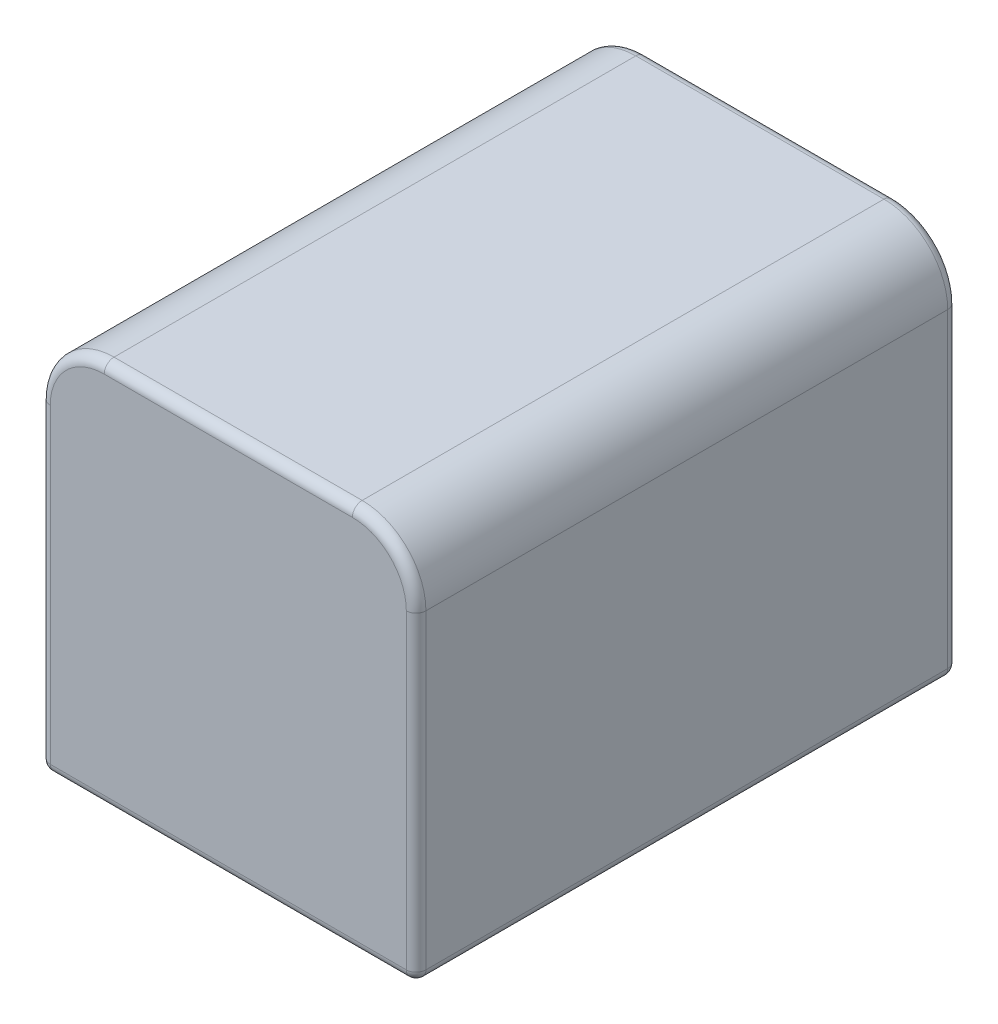
ISO-10303-21;
HEADER;
FILE_DESCRIPTION(('STEP AP214'),'2;1');
FILE_NAME('part.step','',(''),(''),'','','');
FILE_SCHEMA(('AUTOMOTIVE_DESIGN { 1 0 10303 214 1 1 1 1 }'));
ENDSEC;
DATA;
#1=APPLICATION_CONTEXT('core data for automotive mechanical design processes');
#2=APPLICATION_PROTOCOL_DEFINITION('international standard','automotive_design',2000,#1);
#3=PRODUCT_CONTEXT('',#1,'mechanical');
#4=PRODUCT('Part','Part','',(#3));
#5=PRODUCT_RELATED_PRODUCT_CATEGORY('part','',(#4));
#6=PRODUCT_DEFINITION_FORMATION('','',#4);
#7=PRODUCT_DEFINITION_CONTEXT('part definition',#1,'design');
#8=PRODUCT_DEFINITION('design','',#6,#7);
#9=PRODUCT_DEFINITION_SHAPE('','',#8);
#10=(LENGTH_UNIT() NAMED_UNIT(*) SI_UNIT(.MILLI.,.METRE.));
#11=(NAMED_UNIT(*) PLANE_ANGLE_UNIT() SI_UNIT($,.RADIAN.));
#12=(NAMED_UNIT(*) SI_UNIT($,.STERADIAN.) SOLID_ANGLE_UNIT());
#13=UNCERTAINTY_MEASURE_WITH_UNIT(LENGTH_MEASURE(1.E-05),#10,'distance_accuracy_value','');
#14=(GEOMETRIC_REPRESENTATION_CONTEXT(3) GLOBAL_UNCERTAINTY_ASSIGNED_CONTEXT((#13)) GLOBAL_UNIT_ASSIGNED_CONTEXT((#10,
#11,#12)) REPRESENTATION_CONTEXT('',''));
#15=CARTESIAN_POINT('',(0.,0.,0.));
#16=DIRECTION('',(0.,0.,1.));
#17=DIRECTION('',(1.,0.,0.));
#18=AXIS2_PLACEMENT_3D('',#15,#16,#17);
#19=CARTESIAN_POINT('',(-19.15,0.,55.2));
#20=DIRECTION('',(1.,0.,0.));
#21=DIRECTION('',(0.,0.,-1.));
#22=AXIS2_PLACEMENT_3D('',#19,#20,#21);
#23=PLANE('',#22);
#24=DIRECTION('',(0.,0.,-1.));
#25=VECTOR('',#24,1.);
#26=CARTESIAN_POINT('',(-19.15,32.7,55.2));
#27=LINE('',#26,#25);
#28=CARTESIAN_POINT('',(-19.15,32.7,54.2));
#29=VERTEX_POINT('',#28);
#30=CARTESIAN_POINT('',(-19.15,32.7,1.00000000000001));
#31=VERTEX_POINT('',#30);
#32=EDGE_CURVE('E264',#29,#31,#27,.T.);
#33=ORIENTED_EDGE('',*,*,#32,.T.);
#34=DIRECTION('',(0.,-1.,0.));
#35=VECTOR('',#34,1.);
#36=CARTESIAN_POINT('',(-19.15,0.,1.));
#37=LINE('',#36,#35);
#38=CARTESIAN_POINT('',(-19.15,1.,1.));
#39=VERTEX_POINT('',#38);
#40=EDGE_CURVE('E11',#31,#39,#37,.T.);
#41=ORIENTED_EDGE('',*,*,#40,.T.);
#42=DIRECTION('',(0.,0.,-1.));
#43=VECTOR('',#42,1.);
#44=CARTESIAN_POINT('',(-19.15,1.,55.2));
#45=LINE('',#44,#43);
#46=CARTESIAN_POINT('',(-19.15,1.,54.2));
#47=VERTEX_POINT('',#46);
#48=EDGE_CURVE('E39',#39,#47,#45,.F.);
#49=ORIENTED_EDGE('',*,*,#48,.T.);
#50=DIRECTION('',(0.,-1.,0.));
#51=VECTOR('',#50,1.);
#52=CARTESIAN_POINT('',(-19.15,0.,54.2));
#53=LINE('',#52,#51);
#54=EDGE_CURVE('E212',#47,#29,#53,.F.);
#55=ORIENTED_EDGE('',*,*,#54,.T.);
#56=EDGE_LOOP('',(#33,#41,#49,#55));
#57=FACE_BOUND('',#56,.T.);
#58=ADVANCED_FACE('F30',(#57),#23,.F.);
#59=CARTESIAN_POINT('',(-19.15,0.,55.2));
#60=DIRECTION('',(0.,1.,0.));
#61=DIRECTION('',(0.,0.,1.));
#62=AXIS2_PLACEMENT_3D('',#59,#60,#61);
#63=PLANE('',#62);
#64=DIRECTION('',(1.,0.,0.));
#65=VECTOR('',#64,1.);
#66=CARTESIAN_POINT('',(19.15,0.,1.));
#67=LINE('',#66,#65);
#68=CARTESIAN_POINT('',(-18.15,0.,1.));
#69=VERTEX_POINT('',#68);
#70=CARTESIAN_POINT('',(18.15,0.,1.));
#71=VERTEX_POINT('',#70);
#72=EDGE_CURVE('E207',#69,#71,#67,.T.);
#73=ORIENTED_EDGE('',*,*,#72,.T.);
#74=DIRECTION('',(0.,0.,-1.));
#75=VECTOR('',#74,1.);
#76=CARTESIAN_POINT('',(18.15,0.,55.2));
#77=LINE('',#76,#75);
#78=CARTESIAN_POINT('',(18.15,0.,54.2));
#79=VERTEX_POINT('',#78);
#80=EDGE_CURVE('E210',#71,#79,#77,.F.);
#81=ORIENTED_EDGE('',*,*,#80,.T.);
#82=DIRECTION('',(1.,0.,0.));
#83=VECTOR('',#82,1.);
#84=CARTESIAN_POINT('',(-19.15,0.,54.2));
#85=LINE('',#84,#83);
#86=CARTESIAN_POINT('',(-18.15,0.,54.2));
#87=VERTEX_POINT('',#86);
#88=EDGE_CURVE('E205',#79,#87,#85,.F.);
#89=ORIENTED_EDGE('',*,*,#88,.T.);
#90=DIRECTION('',(0.,0.,-1.));
#91=VECTOR('',#90,1.);
#92=CARTESIAN_POINT('',(-18.15,0.,55.2));
#93=LINE('',#92,#91);
#94=EDGE_CURVE('E203',#87,#69,#93,.T.);
#95=ORIENTED_EDGE('',*,*,#94,.T.);
#96=EDGE_LOOP('',(#73,#81,#89,#95));
#97=FACE_BOUND('',#96,.T.);
#98=ADVANCED_FACE('F342',(#97),#63,.F.);
#99=CARTESIAN_POINT('',(19.15,0.,55.2));
#100=DIRECTION('',(-1.,0.,0.));
#101=DIRECTION('',(0.,0.,1.));
#102=AXIS2_PLACEMENT_3D('',#99,#100,#101);
#103=PLANE('',#102);
#104=DIRECTION('',(0.,0.,-1.));
#105=VECTOR('',#104,1.);
#106=CARTESIAN_POINT('',(19.15,1.,55.2));
#107=LINE('',#106,#105);
#108=CARTESIAN_POINT('',(19.15,1.,54.2));
#109=VERTEX_POINT('',#108);
#110=CARTESIAN_POINT('',(19.15,1.,1.));
#111=VERTEX_POINT('',#110);
#112=EDGE_CURVE('E151',#109,#111,#107,.T.);
#113=ORIENTED_EDGE('',*,*,#112,.T.);
#114=DIRECTION('',(0.,1.,0.));
#115=VECTOR('',#114,1.);
#116=CARTESIAN_POINT('',(19.15,32.7,1.));
#117=LINE('',#116,#115);
#118=CARTESIAN_POINT('',(19.15,32.7,1.00000000000001));
#119=VERTEX_POINT('',#118);
#120=EDGE_CURVE('E150',#111,#119,#117,.T.);
#121=ORIENTED_EDGE('',*,*,#120,.T.);
#122=DIRECTION('',(0.,0.,-1.));
#123=VECTOR('',#122,1.);
#124=CARTESIAN_POINT('',(19.15,32.7,55.2));
#125=LINE('',#124,#123);
#126=CARTESIAN_POINT('',(19.15,32.7,54.2));
#127=VERTEX_POINT('',#126);
#128=EDGE_CURVE('E133',#127,#119,#125,.T.);
#129=ORIENTED_EDGE('',*,*,#128,.F.);
#130=DIRECTION('',(0.,1.,0.));
#131=VECTOR('',#130,1.);
#132=CARTESIAN_POINT('',(19.15,0.,54.2));
#133=LINE('',#132,#131);
#134=EDGE_CURVE('E147',#127,#109,#133,.F.);
#135=ORIENTED_EDGE('',*,*,#134,.T.);
#136=EDGE_LOOP('',(#113,#121,#129,#135));
#137=FACE_BOUND('',#136,.T.);
#138=ADVANCED_FACE('F145',(#137),#103,.F.);
#139=CARTESIAN_POINT('',(12.65,32.7,55.2));
#140=DIRECTION('',(0.,0.,-1.));
#141=DIRECTION('',(-1.,0.,0.));
#142=AXIS2_PLACEMENT_3D('',#139,#140,#141);
#143=CYLINDRICAL_SURFACE('',#142,6.5);
#144=ORIENTED_EDGE('',*,*,#128,.T.);
#145=CARTESIAN_POINT('',(12.65,32.7,1.));
#146=DIRECTION('',(0.,0.,-1.));
#147=DIRECTION('',(-1.,0.,0.));
#148=AXIS2_PLACEMENT_3D('',#145,#146,#147);
#149=CIRCLE('',#148,6.5);
#150=CARTESIAN_POINT('',(12.65,39.2,1.00000000000001));
#151=VERTEX_POINT('',#150);
#152=EDGE_CURVE('E140',#119,#151,#149,.F.);
#153=ORIENTED_EDGE('',*,*,#152,.T.);
#154=DIRECTION('',(0.,0.,-1.));
#155=VECTOR('',#154,1.);
#156=CARTESIAN_POINT('',(12.65,39.2,55.2));
#157=LINE('',#156,#155);
#158=CARTESIAN_POINT('',(12.65,39.2,54.2));
#159=VERTEX_POINT('',#158);
#160=EDGE_CURVE('E135',#159,#151,#157,.T.);
#161=ORIENTED_EDGE('',*,*,#160,.F.);
#162=CARTESIAN_POINT('',(12.65,32.7,54.2));
#163=DIRECTION('',(0.,0.,-1.));
#164=DIRECTION('',(-1.,0.,0.));
#165=AXIS2_PLACEMENT_3D('',#162,#163,#164);
#166=CIRCLE('',#165,6.5);
#167=EDGE_CURVE('E130',#159,#127,#166,.T.);
#168=ORIENTED_EDGE('',*,*,#167,.T.);
#169=EDGE_LOOP('',(#144,#153,#161,#168));
#170=FACE_BOUND('',#169,.T.);
#171=ADVANCED_FACE('F132',(#170),#143,.T.);
#172=CARTESIAN_POINT('',(-12.65,39.2,55.2));
#173=DIRECTION('',(0.,-1.,0.));
#174=DIRECTION('',(0.,0.,-1.));
#175=AXIS2_PLACEMENT_3D('',#172,#173,#174);
#176=PLANE('',#175);
#177=ORIENTED_EDGE('',*,*,#160,.T.);
#178=DIRECTION('',(-1.,0.,0.));
#179=VECTOR('',#178,1.);
#180=CARTESIAN_POINT('',(-12.65,39.2,1.));
#181=LINE('',#180,#179);
#182=CARTESIAN_POINT('',(-12.65,39.2,1.00000000000001));
#183=VERTEX_POINT('',#182);
#184=EDGE_CURVE('E186',#151,#183,#181,.T.);
#185=ORIENTED_EDGE('',*,*,#184,.T.);
#186=DIRECTION('',(0.,0.,-1.));
#187=VECTOR('',#186,1.);
#188=CARTESIAN_POINT('',(-12.65,39.2,55.2));
#189=LINE('',#188,#187);
#190=CARTESIAN_POINT('',(-12.65,39.2,54.2));
#191=VERTEX_POINT('',#190);
#192=EDGE_CURVE('E268',#191,#183,#189,.T.);
#193=ORIENTED_EDGE('',*,*,#192,.F.);
#194=DIRECTION('',(-1.,0.,0.));
#195=VECTOR('',#194,1.);
#196=CARTESIAN_POINT('',(-12.65,39.2,54.2));
#197=LINE('',#196,#195);
#198=EDGE_CURVE('E184',#191,#159,#197,.F.);
#199=ORIENTED_EDGE('',*,*,#198,.T.);
#200=EDGE_LOOP('',(#177,#185,#193,#199));
#201=FACE_BOUND('',#200,.T.);
#202=ADVANCED_FACE('F276',(#201),#176,.F.);
#203=CARTESIAN_POINT('',(-12.65,32.7,55.2));
#204=DIRECTION('',(0.,0.,-1.));
#205=DIRECTION('',(-1.,0.,0.));
#206=AXIS2_PLACEMENT_3D('',#203,#204,#205);
#207=CYLINDRICAL_SURFACE('',#206,6.5);
#208=ORIENTED_EDGE('',*,*,#192,.T.);
#209=CARTESIAN_POINT('',(-12.65,32.7,1.));
#210=DIRECTION('',(0.,0.,-1.));
#211=DIRECTION('',(-1.,0.,0.));
#212=AXIS2_PLACEMENT_3D('',#209,#210,#211);
#213=CIRCLE('',#212,6.5);
#214=EDGE_CURVE('E190',#183,#31,#213,.F.);
#215=ORIENTED_EDGE('',*,*,#214,.T.);
#216=ORIENTED_EDGE('',*,*,#32,.F.);
#217=CARTESIAN_POINT('',(-12.65,32.7,54.2));
#218=DIRECTION('',(0.,0.,-1.));
#219=DIRECTION('',(-1.,0.,0.));
#220=AXIS2_PLACEMENT_3D('',#217,#218,#219);
#221=CIRCLE('',#220,6.5);
#222=EDGE_CURVE('E188',#29,#191,#221,.T.);
#223=ORIENTED_EDGE('',*,*,#222,.T.);
#224=EDGE_LOOP('',(#208,#215,#216,#223));
#225=FACE_BOUND('',#224,.T.);
#226=ADVANCED_FACE('F325',(#225),#207,.T.);
#227=CARTESIAN_POINT('',(-12.65,32.7,55.2));
#228=DIRECTION('',(0.,0.,-1.));
#229=DIRECTION('',(-1.,0.,0.));
#230=AXIS2_PLACEMENT_3D('',#227,#228,#229);
#231=PLANE('',#230);
#232=DIRECTION('',(1.,0.,0.));
#233=VECTOR('',#232,1.);
#234=CARTESIAN_POINT('',(-12.65,1.,55.2));
#235=LINE('',#234,#233);
#236=CARTESIAN_POINT('',(-18.15,1.,55.2));
#237=VERTEX_POINT('',#236);
#238=CARTESIAN_POINT('',(18.15,1.,55.2));
#239=VERTEX_POINT('',#238);
#240=EDGE_CURVE('E194',#237,#239,#235,.T.);
#241=ORIENTED_EDGE('',*,*,#240,.T.);
#242=DIRECTION('',(0.,1.,0.));
#243=VECTOR('',#242,1.);
#244=CARTESIAN_POINT('',(18.15,32.7,55.2));
#245=LINE('',#244,#243);
#246=CARTESIAN_POINT('',(18.15,32.7,55.2));
#247=VERTEX_POINT('',#246);
#248=EDGE_CURVE('E201',#239,#247,#245,.T.);
#249=ORIENTED_EDGE('',*,*,#248,.T.);
#250=CARTESIAN_POINT('',(12.65,32.7,55.2));
#251=DIRECTION('',(0.,0.,-1.));
#252=DIRECTION('',(-1.,0.,0.));
#253=AXIS2_PLACEMENT_3D('',#250,#251,#252);
#254=CIRCLE('',#253,5.5);
#255=CARTESIAN_POINT('',(12.65,38.2,55.2));
#256=VERTEX_POINT('',#255);
#257=EDGE_CURVE('E156',#247,#256,#254,.F.);
#258=ORIENTED_EDGE('',*,*,#257,.T.);
#259=DIRECTION('',(-1.,0.,0.));
#260=VECTOR('',#259,1.);
#261=CARTESIAN_POINT('',(-12.65,38.2,55.2));
#262=LINE('',#261,#260);
#263=CARTESIAN_POINT('',(-12.65,38.2,55.2));
#264=VERTEX_POINT('',#263);
#265=EDGE_CURVE('E198',#256,#264,#262,.T.);
#266=ORIENTED_EDGE('',*,*,#265,.T.);
#267=CARTESIAN_POINT('',(-12.65,32.7,55.2));
#268=DIRECTION('',(0.,0.,-1.));
#269=DIRECTION('',(-1.,0.,0.));
#270=AXIS2_PLACEMENT_3D('',#267,#268,#269);
#271=CIRCLE('',#270,5.5);
#272=CARTESIAN_POINT('',(-18.15,32.7,55.2));
#273=VERTEX_POINT('',#272);
#274=EDGE_CURVE('E196',#264,#273,#271,.F.);
#275=ORIENTED_EDGE('',*,*,#274,.T.);
#276=DIRECTION('',(0.,-1.,0.));
#277=VECTOR('',#276,1.);
#278=CARTESIAN_POINT('',(-18.15,32.7,55.2));
#279=LINE('',#278,#277);
#280=EDGE_CURVE('E192',#273,#237,#279,.T.);
#281=ORIENTED_EDGE('',*,*,#280,.T.);
#282=EDGE_LOOP('',(#241,#249,#258,#266,#275,#281));
#283=FACE_BOUND('',#282,.T.);
#284=ADVANCED_FACE('F331',(#283),#231,.F.);
#285=CARTESIAN_POINT('',(-12.65,32.7,0.));
#286=DIRECTION('',(0.,0.,-1.));
#287=DIRECTION('',(-1.,0.,0.));
#288=AXIS2_PLACEMENT_3D('',#285,#286,#287);
#289=PLANE('',#288);
#290=CARTESIAN_POINT('',(12.65,32.7,0.));
#291=DIRECTION('',(0.,0.,-1.));
#292=DIRECTION('',(-1.,0.,0.));
#293=AXIS2_PLACEMENT_3D('',#290,#291,#292);
#294=CIRCLE('',#293,5.5);
#295=CARTESIAN_POINT('',(12.65,38.2,0.));
#296=VERTEX_POINT('',#295);
#297=CARTESIAN_POINT('',(18.15,32.7,0.));
#298=VERTEX_POINT('',#297);
#299=EDGE_CURVE('E179',#296,#298,#294,.T.);
#300=ORIENTED_EDGE('',*,*,#299,.T.);
#301=DIRECTION('',(0.,1.,0.));
#302=VECTOR('',#301,1.);
#303=CARTESIAN_POINT('',(18.15,0.,0.));
#304=LINE('',#303,#302);
#305=CARTESIAN_POINT('',(18.15,1.,0.));
#306=VERTEX_POINT('',#305);
#307=EDGE_CURVE('E141',#298,#306,#304,.F.);
#308=ORIENTED_EDGE('',*,*,#307,.T.);
#309=DIRECTION('',(1.,0.,0.));
#310=VECTOR('',#309,1.);
#311=CARTESIAN_POINT('',(-19.15,1.,0.));
#312=LINE('',#311,#310);
#313=CARTESIAN_POINT('',(-18.15,1.,0.));
#314=VERTEX_POINT('',#313);
#315=EDGE_CURVE('E173',#306,#314,#312,.F.);
#316=ORIENTED_EDGE('',*,*,#315,.T.);
#317=DIRECTION('',(0.,-1.,0.));
#318=VECTOR('',#317,1.);
#319=CARTESIAN_POINT('',(-18.15,32.7,0.));
#320=LINE('',#319,#318);
#321=CARTESIAN_POINT('',(-18.15,32.7,0.));
#322=VERTEX_POINT('',#321);
#323=EDGE_CURVE('E168',#314,#322,#320,.F.);
#324=ORIENTED_EDGE('',*,*,#323,.T.);
#325=CARTESIAN_POINT('',(-12.65,32.7,0.));
#326=DIRECTION('',(0.,0.,-1.));
#327=DIRECTION('',(-1.,0.,0.));
#328=AXIS2_PLACEMENT_3D('',#325,#326,#327);
#329=CIRCLE('',#328,5.5);
#330=CARTESIAN_POINT('',(-12.65,38.2,0.));
#331=VERTEX_POINT('',#330);
#332=EDGE_CURVE('E175',#322,#331,#329,.T.);
#333=ORIENTED_EDGE('',*,*,#332,.T.);
#334=DIRECTION('',(-1.,0.,0.));
#335=VECTOR('',#334,1.);
#336=CARTESIAN_POINT('',(12.65,38.2,0.));
#337=LINE('',#336,#335);
#338=EDGE_CURVE('E177',#331,#296,#337,.F.);
#339=ORIENTED_EDGE('',*,*,#338,.T.);
#340=EDGE_LOOP('',(#300,#308,#316,#324,#333,#339));
#341=FACE_BOUND('',#340,.T.);
#342=ADVANCED_FACE('F290',(#341),#289,.T.);
#343=CARTESIAN_POINT('',(-12.65,32.7,54.2));
#344=DIRECTION('',(0.,0.,-1.));
#345=DIRECTION('',(-1.,0.,0.));
#346=AXIS2_PLACEMENT_3D('',#343,#344,#345);
#347=TOROIDAL_SURFACE('',#346,5.5,1.);
#348=CARTESIAN_POINT('',(-12.65,38.2,54.2));
#349=DIRECTION('',(1.,0.,0.));
#350=DIRECTION('',(0.,0.,-1.));
#351=AXIS2_PLACEMENT_3D('',#348,#349,#350);
#352=CIRCLE('',#351,1.);
#353=EDGE_CURVE('E257',#191,#264,#352,.T.);
#354=ORIENTED_EDGE('',*,*,#353,.F.);
#355=ORIENTED_EDGE('',*,*,#222,.F.);
#356=CARTESIAN_POINT('',(-18.15,32.7,54.2));
#357=DIRECTION('',(0.,-1.,0.));
#358=DIRECTION('',(0.,0.,-1.));
#359=AXIS2_PLACEMENT_3D('',#356,#357,#358);
#360=CIRCLE('',#359,1.);
#361=EDGE_CURVE('E34',#273,#29,#360,.T.);
#362=ORIENTED_EDGE('',*,*,#361,.F.);
#363=ORIENTED_EDGE('',*,*,#274,.F.);
#364=EDGE_LOOP('',(#354,#355,#362,#363));
#365=FACE_BOUND('',#364,.T.);
#366=ADVANCED_FACE('F32',(#365),#347,.T.);
#367=CARTESIAN_POINT('',(-18.15,32.7,54.2));
#368=DIRECTION('',(0.,-1.,0.));
#369=DIRECTION('',(0.,0.,-1.));
#370=AXIS2_PLACEMENT_3D('',#367,#368,#369);
#371=CYLINDRICAL_SURFACE('',#370,1.);
#372=ORIENTED_EDGE('',*,*,#361,.T.);
#373=ORIENTED_EDGE('',*,*,#54,.F.);
#374=CARTESIAN_POINT('',(-18.15,1.,54.2));
#375=DIRECTION('',(0.,-1.,0.));
#376=DIRECTION('',(1.,0.,0.));
#377=AXIS2_PLACEMENT_3D('',#374,#375,#376);
#378=CIRCLE('',#377,1.);
#379=EDGE_CURVE('E255',#237,#47,#378,.T.);
#380=ORIENTED_EDGE('',*,*,#379,.F.);
#381=ORIENTED_EDGE('',*,*,#280,.F.);
#382=EDGE_LOOP('',(#372,#373,#380,#381));
#383=FACE_BOUND('',#382,.T.);
#384=ADVANCED_FACE('F322',(#383),#371,.T.);
#385=CARTESIAN_POINT('',(-12.65,38.2,54.2));
#386=DIRECTION('',(-1.,0.,0.));
#387=DIRECTION('',(0.,0.,1.));
#388=AXIS2_PLACEMENT_3D('',#385,#386,#387);
#389=CYLINDRICAL_SURFACE('',#388,1.);
#390=ORIENTED_EDGE('',*,*,#353,.T.);
#391=ORIENTED_EDGE('',*,*,#265,.F.);
#392=CARTESIAN_POINT('',(12.65,38.2,54.2));
#393=DIRECTION('',(1.,0.,0.));
#394=DIRECTION('',(0.,0.,-1.));
#395=AXIS2_PLACEMENT_3D('',#392,#393,#394);
#396=CIRCLE('',#395,1.);
#397=EDGE_CURVE('E253',#159,#256,#396,.T.);
#398=ORIENTED_EDGE('',*,*,#397,.F.);
#399=ORIENTED_EDGE('',*,*,#198,.F.);
#400=EDGE_LOOP('',(#390,#391,#398,#399));
#401=FACE_BOUND('',#400,.T.);
#402=ADVANCED_FACE('F329',(#401),#389,.T.);
#403=CARTESIAN_POINT('',(-18.15,1.,54.2));
#404=DIRECTION('',(0.,0.,1.));
#405=DIRECTION('',(1.,0.,0.));
#406=AXIS2_PLACEMENT_3D('',#403,#404,#405);
#407=SPHERICAL_SURFACE('',#406,1.);
#408=CARTESIAN_POINT('',(-18.15,1.,54.2));
#409=DIRECTION('',(-1.,0.,0.));
#410=DIRECTION('',(0.,0.,1.));
#411=AXIS2_PLACEMENT_3D('',#408,#409,#410);
#412=CIRCLE('',#411,1.);
#413=EDGE_CURVE('E160',#237,#87,#412,.F.);
#414=ORIENTED_EDGE('',*,*,#413,.F.);
#415=ORIENTED_EDGE('',*,*,#379,.T.);
#416=CARTESIAN_POINT('',(-18.15,1.,54.2));
#417=DIRECTION('',(0.,0.,1.));
#418=DIRECTION('',(1.,0.,0.));
#419=AXIS2_PLACEMENT_3D('',#416,#417,#418);
#420=CIRCLE('',#419,1.);
#421=EDGE_CURVE('E250',#87,#47,#420,.F.);
#422=ORIENTED_EDGE('',*,*,#421,.F.);
#423=EDGE_LOOP('',(#414,#415,#422));
#424=FACE_BOUND('',#423,.T.);
#425=ADVANCED_FACE('F319',(#424),#407,.T.);
#426=CARTESIAN_POINT('',(12.65,32.7,54.2));
#427=DIRECTION('',(0.,0.,-1.));
#428=DIRECTION('',(-1.,0.,0.));
#429=AXIS2_PLACEMENT_3D('',#426,#427,#428);
#430=TOROIDAL_SURFACE('',#429,5.5,1.);
#431=ORIENTED_EDGE('',*,*,#397,.T.);
#432=ORIENTED_EDGE('',*,*,#257,.F.);
#433=CARTESIAN_POINT('',(18.15,32.7,54.2));
#434=DIRECTION('',(0.,-1.,0.));
#435=DIRECTION('',(0.,0.,-1.));
#436=AXIS2_PLACEMENT_3D('',#433,#434,#435);
#437=CIRCLE('',#436,1.);
#438=EDGE_CURVE('E154',#127,#247,#437,.T.);
#439=ORIENTED_EDGE('',*,*,#438,.F.);
#440=ORIENTED_EDGE('',*,*,#167,.F.);
#441=EDGE_LOOP('',(#431,#432,#439,#440));
#442=FACE_BOUND('',#441,.T.);
#443=ADVANCED_FACE('F155',(#442),#430,.T.);
#444=CARTESIAN_POINT('',(-18.15,1.,55.2));
#445=DIRECTION('',(0.,0.,-1.));
#446=DIRECTION('',(-1.,0.,0.));
#447=AXIS2_PLACEMENT_3D('',#444,#445,#446);
#448=CYLINDRICAL_SURFACE('',#447,1.);
#449=ORIENTED_EDGE('',*,*,#421,.T.);
#450=ORIENTED_EDGE('',*,*,#48,.F.);
#451=CARTESIAN_POINT('',(-18.15,1.,1.));
#452=DIRECTION('',(0.,0.,-1.));
#453=DIRECTION('',(-1.,0.,0.));
#454=AXIS2_PLACEMENT_3D('',#451,#452,#453);
#455=CIRCLE('',#454,1.);
#456=EDGE_CURVE('E243',#69,#39,#455,.T.);
#457=ORIENTED_EDGE('',*,*,#456,.F.);
#458=ORIENTED_EDGE('',*,*,#94,.F.);
#459=EDGE_LOOP('',(#449,#450,#457,#458));
#460=FACE_BOUND('',#459,.T.);
#461=ADVANCED_FACE('F315',(#460),#448,.T.);
#462=CARTESIAN_POINT('',(-12.65,1.,54.2));
#463=DIRECTION('',(1.,0.,0.));
#464=DIRECTION('',(0.,0.,-1.));
#465=AXIS2_PLACEMENT_3D('',#462,#463,#464);
#466=CYLINDRICAL_SURFACE('',#465,1.);
#467=ORIENTED_EDGE('',*,*,#413,.T.);
#468=ORIENTED_EDGE('',*,*,#88,.F.);
#469=CARTESIAN_POINT('',(18.15,1.,54.2));
#470=DIRECTION('',(1.,0.,0.));
#471=DIRECTION('',(0.,0.,-1.));
#472=AXIS2_PLACEMENT_3D('',#469,#470,#471);
#473=CIRCLE('',#472,1.);
#474=EDGE_CURVE('E240',#239,#79,#473,.T.);
#475=ORIENTED_EDGE('',*,*,#474,.F.);
#476=ORIENTED_EDGE('',*,*,#240,.F.);
#477=EDGE_LOOP('',(#467,#468,#475,#476));
#478=FACE_BOUND('',#477,.T.);
#479=ADVANCED_FACE('F335',(#478),#466,.T.);
#480=CARTESIAN_POINT('',(18.15,32.7,54.2));
#481=DIRECTION('',(0.,1.,0.));
#482=DIRECTION('',(0.,0.,1.));
#483=AXIS2_PLACEMENT_3D('',#480,#481,#482);
#484=CYLINDRICAL_SURFACE('',#483,1.);
#485=ORIENTED_EDGE('',*,*,#438,.T.);
#486=ORIENTED_EDGE('',*,*,#248,.F.);
#487=CARTESIAN_POINT('',(18.15,1.,54.2));
#488=DIRECTION('',(0.,-1.,0.));
#489=DIRECTION('',(0.,0.,-1.));
#490=AXIS2_PLACEMENT_3D('',#487,#488,#489);
#491=CIRCLE('',#490,1.);
#492=EDGE_CURVE('E165',#109,#239,#491,.T.);
#493=ORIENTED_EDGE('',*,*,#492,.F.);
#494=ORIENTED_EDGE('',*,*,#134,.F.);
#495=EDGE_LOOP('',(#485,#486,#493,#494));
#496=FACE_BOUND('',#495,.T.);
#497=ADVANCED_FACE('F163',(#496),#484,.T.);
#498=CARTESIAN_POINT('',(-18.15,0.,1.));
#499=DIRECTION('',(0.,1.,0.));
#500=DIRECTION('',(0.,0.,1.));
#501=AXIS2_PLACEMENT_3D('',#498,#499,#500);
#502=CYLINDRICAL_SURFACE('',#501,1.);
#503=CARTESIAN_POINT('',(-18.15,1.,1.));
#504=DIRECTION('',(0.,-1.,0.));
#505=DIRECTION('',(0.,0.,-1.));
#506=AXIS2_PLACEMENT_3D('',#503,#504,#505);
#507=CIRCLE('',#506,1.);
#508=EDGE_CURVE('E161',#39,#314,#507,.T.);
#509=ORIENTED_EDGE('',*,*,#508,.F.);
#510=ORIENTED_EDGE('',*,*,#40,.F.);
#511=CARTESIAN_POINT('',(-18.15,32.7,1.));
#512=DIRECTION('',(0.,1.,0.));
#513=DIRECTION('',(0.,0.,1.));
#514=AXIS2_PLACEMENT_3D('',#511,#512,#513);
#515=CIRCLE('',#514,1.);
#516=EDGE_CURVE('E236',#322,#31,#515,.T.);
#517=ORIENTED_EDGE('',*,*,#516,.F.);
#518=ORIENTED_EDGE('',*,*,#323,.F.);
#519=EDGE_LOOP('',(#509,#510,#517,#518));
#520=FACE_BOUND('',#519,.T.);
#521=ADVANCED_FACE('F308',(#520),#502,.T.);
#522=CARTESIAN_POINT('',(-18.15,1.,1.));
#523=DIRECTION('',(0.,0.,1.));
#524=DIRECTION('',(1.,0.,0.));
#525=AXIS2_PLACEMENT_3D('',#522,#523,#524);
#526=SPHERICAL_SURFACE('',#525,1.);
#527=ORIENTED_EDGE('',*,*,#456,.T.);
#528=ORIENTED_EDGE('',*,*,#508,.T.);
#529=CARTESIAN_POINT('',(-18.15,1.,1.));
#530=DIRECTION('',(-1.,0.,0.));
#531=DIRECTION('',(0.,0.,1.));
#532=AXIS2_PLACEMENT_3D('',#529,#530,#531);
#533=CIRCLE('',#532,1.);
#534=EDGE_CURVE('E233',#69,#314,#533,.F.);
#535=ORIENTED_EDGE('',*,*,#534,.F.);
#536=EDGE_LOOP('',(#527,#528,#535));
#537=FACE_BOUND('',#536,.T.);
#538=ADVANCED_FACE('F311',(#537),#526,.T.);
#539=CARTESIAN_POINT('',(18.15,1.,54.2));
#540=DIRECTION('',(0.,0.,1.));
#541=DIRECTION('',(1.,0.,0.));
#542=AXIS2_PLACEMENT_3D('',#539,#540,#541);
#543=SPHERICAL_SURFACE('',#542,1.);
#544=ORIENTED_EDGE('',*,*,#492,.T.);
#545=ORIENTED_EDGE('',*,*,#474,.T.);
#546=CARTESIAN_POINT('',(18.15,1.,54.2));
#547=DIRECTION('',(0.,0.,1.));
#548=DIRECTION('',(1.,0.,0.));
#549=AXIS2_PLACEMENT_3D('',#546,#547,#548);
#550=CIRCLE('',#549,1.);
#551=EDGE_CURVE('E230',#109,#79,#550,.F.);
#552=ORIENTED_EDGE('',*,*,#551,.F.);
#553=EDGE_LOOP('',(#544,#545,#552));
#554=FACE_BOUND('',#553,.T.);
#555=ADVANCED_FACE('F337',(#554),#543,.T.);
#556=CARTESIAN_POINT('',(-12.65,32.7,1.));
#557=DIRECTION('',(0.,0.,-1.));
#558=DIRECTION('',(-1.,0.,0.));
#559=AXIS2_PLACEMENT_3D('',#556,#557,#558);
#560=TOROIDAL_SURFACE('',#559,5.5,1.);
#561=ORIENTED_EDGE('',*,*,#516,.T.);
#562=ORIENTED_EDGE('',*,*,#214,.F.);
#563=CARTESIAN_POINT('',(-12.65,38.2,1.));
#564=DIRECTION('',(1.,0.,0.));
#565=DIRECTION('',(0.,0.,-1.));
#566=AXIS2_PLACEMENT_3D('',#563,#564,#565);
#567=CIRCLE('',#566,1.);
#568=EDGE_CURVE('E227',#331,#183,#567,.T.);
#569=ORIENTED_EDGE('',*,*,#568,.F.);
#570=ORIENTED_EDGE('',*,*,#332,.F.);
#571=EDGE_LOOP('',(#561,#562,#569,#570));
#572=FACE_BOUND('',#571,.T.);
#573=ADVANCED_FACE('F365',(#572),#560,.T.);
#574=CARTESIAN_POINT('',(-19.15,1.,1.));
#575=DIRECTION('',(-1.,0.,0.));
#576=DIRECTION('',(0.,0.,1.));
#577=AXIS2_PLACEMENT_3D('',#574,#575,#576);
#578=CYLINDRICAL_SURFACE('',#577,1.);
#579=ORIENTED_EDGE('',*,*,#534,.T.);
#580=ORIENTED_EDGE('',*,*,#315,.F.);
#581=CARTESIAN_POINT('',(18.15,1.,1.));
#582=DIRECTION('',(1.,0.,0.));
#583=DIRECTION('',(0.,0.,-1.));
#584=AXIS2_PLACEMENT_3D('',#581,#582,#583);
#585=CIRCLE('',#584,1.);
#586=EDGE_CURVE('E224',#71,#306,#585,.T.);
#587=ORIENTED_EDGE('',*,*,#586,.F.);
#588=ORIENTED_EDGE('',*,*,#72,.F.);
#589=EDGE_LOOP('',(#579,#580,#587,#588));
#590=FACE_BOUND('',#589,.T.);
#591=ADVANCED_FACE('F302',(#590),#578,.T.);
#592=CARTESIAN_POINT('',(18.15,1.,55.2));
#593=DIRECTION('',(0.,0.,-1.));
#594=DIRECTION('',(-1.,0.,0.));
#595=AXIS2_PLACEMENT_3D('',#592,#593,#594);
#596=CYLINDRICAL_SURFACE('',#595,1.);
#597=ORIENTED_EDGE('',*,*,#551,.T.);
#598=ORIENTED_EDGE('',*,*,#80,.F.);
#599=CARTESIAN_POINT('',(18.15,1.,1.));
#600=DIRECTION('',(0.,0.,-1.));
#601=DIRECTION('',(-1.,0.,0.));
#602=AXIS2_PLACEMENT_3D('',#599,#600,#601);
#603=CIRCLE('',#602,1.);
#604=EDGE_CURVE('E222',#111,#71,#603,.T.);
#605=ORIENTED_EDGE('',*,*,#604,.F.);
#606=ORIENTED_EDGE('',*,*,#112,.F.);
#607=EDGE_LOOP('',(#597,#598,#605,#606));
#608=FACE_BOUND('',#607,.T.);
#609=ADVANCED_FACE('F340',(#608),#596,.T.);
#610=CARTESIAN_POINT('',(-12.65,38.2,1.));
#611=DIRECTION('',(1.,0.,0.));
#612=DIRECTION('',(0.,0.,-1.));
#613=AXIS2_PLACEMENT_3D('',#610,#611,#612);
#614=CYLINDRICAL_SURFACE('',#613,1.);
#615=ORIENTED_EDGE('',*,*,#568,.T.);
#616=ORIENTED_EDGE('',*,*,#184,.F.);
#617=CARTESIAN_POINT('',(12.65,38.2,1.));
#618=DIRECTION('',(1.,0.,0.));
#619=DIRECTION('',(0.,0.,-1.));
#620=AXIS2_PLACEMENT_3D('',#617,#618,#619);
#621=CIRCLE('',#620,1.);
#622=EDGE_CURVE('E219',#296,#151,#621,.T.);
#623=ORIENTED_EDGE('',*,*,#622,.F.);
#624=ORIENTED_EDGE('',*,*,#338,.F.);
#625=EDGE_LOOP('',(#615,#616,#623,#624));
#626=FACE_BOUND('',#625,.T.);
#627=ADVANCED_FACE('F280',(#626),#614,.T.);
#628=CARTESIAN_POINT('',(18.15,1.,1.));
#629=DIRECTION('',(0.,0.,1.));
#630=DIRECTION('',(1.,0.,0.));
#631=AXIS2_PLACEMENT_3D('',#628,#629,#630);
#632=SPHERICAL_SURFACE('',#631,1.);
#633=ORIENTED_EDGE('',*,*,#604,.T.);
#634=ORIENTED_EDGE('',*,*,#586,.T.);
#635=CARTESIAN_POINT('',(18.15,1.,1.));
#636=DIRECTION('',(0.,-1.,0.));
#637=DIRECTION('',(1.,0.,0.));
#638=AXIS2_PLACEMENT_3D('',#635,#636,#637);
#639=CIRCLE('',#638,1.);
#640=EDGE_CURVE('E217',#111,#306,#639,.F.);
#641=ORIENTED_EDGE('',*,*,#640,.F.);
#642=EDGE_LOOP('',(#633,#634,#641));
#643=FACE_BOUND('',#642,.T.);
#644=ADVANCED_FACE('F297',(#643),#632,.T.);
#645=CARTESIAN_POINT('',(12.65,32.7,1.));
#646=DIRECTION('',(0.,0.,-1.));
#647=DIRECTION('',(-1.,0.,0.));
#648=AXIS2_PLACEMENT_3D('',#645,#646,#647);
#649=TOROIDAL_SURFACE('',#648,5.5,1.);
#650=ORIENTED_EDGE('',*,*,#622,.T.);
#651=ORIENTED_EDGE('',*,*,#152,.F.);
#652=CARTESIAN_POINT('',(18.15,32.7,1.));
#653=DIRECTION('',(0.,-1.,0.));
#654=DIRECTION('',(0.,0.,-1.));
#655=AXIS2_PLACEMENT_3D('',#652,#653,#654);
#656=CIRCLE('',#655,1.);
#657=EDGE_CURVE('E215',#298,#119,#656,.T.);
#658=ORIENTED_EDGE('',*,*,#657,.F.);
#659=ORIENTED_EDGE('',*,*,#299,.F.);
#660=EDGE_LOOP('',(#650,#651,#658,#659));
#661=FACE_BOUND('',#660,.T.);
#662=ADVANCED_FACE('F286',(#661),#649,.T.);
#663=CARTESIAN_POINT('',(18.15,0.,1.));
#664=DIRECTION('',(0.,-1.,0.));
#665=DIRECTION('',(0.,0.,-1.));
#666=AXIS2_PLACEMENT_3D('',#663,#664,#665);
#667=CYLINDRICAL_SURFACE('',#666,1.);
#668=ORIENTED_EDGE('',*,*,#640,.T.);
#669=ORIENTED_EDGE('',*,*,#307,.F.);
#670=ORIENTED_EDGE('',*,*,#657,.T.);
#671=ORIENTED_EDGE('',*,*,#120,.F.);
#672=EDGE_LOOP('',(#668,#669,#670,#671));
#673=FACE_BOUND('',#672,.T.);
#674=ADVANCED_FACE('F292',(#673),#667,.T.);
#675=CLOSED_SHELL('',(#58,#98,#138,#171,#202,#226,#284,#342,#366,#384,#402,#425,#443,#461,#479,
#497,#521,#538,#555,#573,#591,#609,#627,#644,#662,#674));
#676=MANIFOLD_SOLID_BREP('B2',#675);
#677=ADVANCED_BREP_SHAPE_REPRESENTATION('',(#18,#676),#14);
#678=SHAPE_DEFINITION_REPRESENTATION(#9,#677);
ENDSEC;
END-ISO-10303-21;
